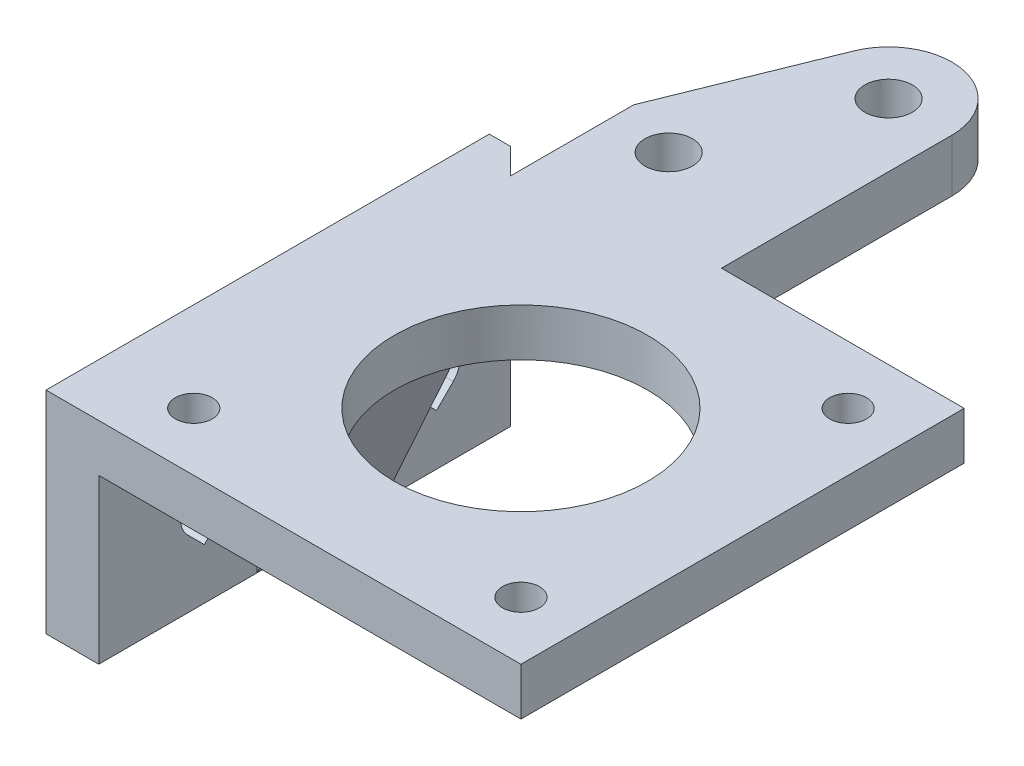
ISO-10303-21;
HEADER;
FILE_DESCRIPTION(('STEP AP214'),'2;1');
FILE_NAME('part.step','',(''),(''),'','','');
FILE_SCHEMA(('AUTOMOTIVE_DESIGN { 1 0 10303 214 1 1 1 1 }'));
ENDSEC;
DATA;
#1=APPLICATION_CONTEXT('core data for automotive mechanical design processes');
#2=APPLICATION_PROTOCOL_DEFINITION('international standard','automotive_design',2000,#1);
#3=PRODUCT_CONTEXT('',#1,'mechanical');
#4=PRODUCT('Part','Part','',(#3));
#5=PRODUCT_RELATED_PRODUCT_CATEGORY('part','',(#4));
#6=PRODUCT_DEFINITION_FORMATION('','',#4);
#7=PRODUCT_DEFINITION_CONTEXT('part definition',#1,'design');
#8=PRODUCT_DEFINITION('design','',#6,#7);
#9=PRODUCT_DEFINITION_SHAPE('','',#8);
#10=(LENGTH_UNIT() NAMED_UNIT(*) SI_UNIT(.MILLI.,.METRE.));
#11=(NAMED_UNIT(*) PLANE_ANGLE_UNIT() SI_UNIT($,.RADIAN.));
#12=(NAMED_UNIT(*) SI_UNIT($,.STERADIAN.) SOLID_ANGLE_UNIT());
#13=UNCERTAINTY_MEASURE_WITH_UNIT(LENGTH_MEASURE(1.E-05),#10,'distance_accuracy_value','');
#14=(GEOMETRIC_REPRESENTATION_CONTEXT(3) GLOBAL_UNCERTAINTY_ASSIGNED_CONTEXT((#13)) GLOBAL_UNIT_ASSIGNED_CONTEXT((#10,
#11,#12)) REPRESENTATION_CONTEXT('',''));
#15=CARTESIAN_POINT('',(0.,0.,0.));
#16=DIRECTION('',(0.,0.,1.));
#17=DIRECTION('',(1.,0.,0.));
#18=AXIS2_PLACEMENT_3D('',#15,#16,#17);
#19=CARTESIAN_POINT('',(45.,-4.5,21.));
#20=DIRECTION('',(0.,1.,0.));
#21=DIRECTION('',(-1.,0.,0.));
#22=AXIS2_PLACEMENT_3D('',#19,#20,#21);
#23=PLANE('',#22);
#24=CARTESIAN_POINT('',(39.5,-4.5,15.5));
#25=DIRECTION('',(0.,1.,0.));
#26=DIRECTION('',(-1.,0.,0.));
#27=AXIS2_PLACEMENT_3D('',#24,#25,#26);
#28=CIRCLE('',#27,1.75);
#29=CARTESIAN_POINT('',(37.75,-4.5,15.5));
#30=VERTEX_POINT('',#29);
#31=EDGE_CURVE('E319',#30,#30,#28,.F.);
#32=ORIENTED_EDGE('',*,*,#31,.F.);
#33=EDGE_LOOP('',(#32));
#34=FACE_BOUND('',#33,.T.);
#35=CARTESIAN_POINT('',(8.5,-4.50000000000001,15.5));
#36=DIRECTION('',(0.,1.,0.));
#37=DIRECTION('',(-1.,0.,0.));
#38=AXIS2_PLACEMENT_3D('',#35,#36,#37);
#39=CIRCLE('',#38,1.75);
#40=CARTESIAN_POINT('',(6.75,-4.50000000000001,15.5));
#41=VERTEX_POINT('',#40);
#42=EDGE_CURVE('E313',#41,#41,#39,.F.);
#43=ORIENTED_EDGE('',*,*,#42,.F.);
#44=EDGE_LOOP('',(#43));
#45=FACE_BOUND('',#44,.T.);
#46=CARTESIAN_POINT('',(39.5,-4.5,-15.5));
#47=DIRECTION('',(0.,1.,0.));
#48=DIRECTION('',(-1.,0.,0.));
#49=AXIS2_PLACEMENT_3D('',#46,#47,#48);
#50=CIRCLE('',#49,1.75);
#51=CARTESIAN_POINT('',(37.75,-4.5,-15.5));
#52=VERTEX_POINT('',#51);
#53=EDGE_CURVE('E307',#52,#52,#50,.F.);
#54=ORIENTED_EDGE('',*,*,#53,.F.);
#55=EDGE_LOOP('',(#54));
#56=FACE_BOUND('',#55,.T.);
#57=DIRECTION('',(-0.984783558817937,0.,0.173785333909048));
#58=VECTOR('',#57,1.);
#59=CARTESIAN_POINT('',(5.,-4.5,-18.));
#60=LINE('',#59,#58);
#61=CARTESIAN_POINT('',(22.,-4.5,-21.));
#62=VERTEX_POINT('',#61);
#63=CARTESIAN_POINT('',(5.,-4.5,-18.));
#64=VERTEX_POINT('',#63);
#65=EDGE_CURVE('E208',#62,#64,#60,.T.);
#66=ORIENTED_EDGE('',*,*,#65,.F.);
#67=DIRECTION('',(1.,0.,0.));
#68=VECTOR('',#67,1.);
#69=CARTESIAN_POINT('',(45.,-4.5,-21.));
#70=LINE('',#69,#68);
#71=CARTESIAN_POINT('',(45.,-4.5,-21.));
#72=VERTEX_POINT('',#71);
#73=EDGE_CURVE('E280',#62,#72,#70,.T.);
#74=ORIENTED_EDGE('',*,*,#73,.T.);
#75=DIRECTION('',(0.,0.,-1.));
#76=VECTOR('',#75,1.);
#77=CARTESIAN_POINT('',(45.,-4.5,21.));
#78=LINE('',#77,#76);
#79=CARTESIAN_POINT('',(45.,-4.5,21.));
#80=VERTEX_POINT('',#79);
#81=EDGE_CURVE('E430',#80,#72,#78,.T.);
#82=ORIENTED_EDGE('',*,*,#81,.F.);
#83=DIRECTION('',(1.,0.,0.));
#84=VECTOR('',#83,1.);
#85=CARTESIAN_POINT('',(45.,-4.5,21.));
#86=LINE('',#85,#84);
#87=CARTESIAN_POINT('',(5.,-4.5,21.));
#88=VERTEX_POINT('',#87);
#89=EDGE_CURVE('E294',#88,#80,#86,.T.);
#90=ORIENTED_EDGE('',*,*,#89,.F.);
#91=DIRECTION('',(0.,0.,-1.));
#92=VECTOR('',#91,1.);
#93=CARTESIAN_POINT('',(5.,-4.5,21.));
#94=LINE('',#93,#92);
#95=CARTESIAN_POINT('',(5.,-4.5,6.));
#96=VERTEX_POINT('',#95);
#97=EDGE_CURVE('E417',#88,#96,#94,.T.);
#98=ORIENTED_EDGE('',*,*,#97,.T.);
#99=DIRECTION('',(-1.,0.,0.));
#100=VECTOR('',#99,1.);
#101=CARTESIAN_POINT('',(12.,-4.50000000000001,6.));
#102=LINE('',#101,#100);
#103=CARTESIAN_POINT('',(12.,-4.50000000000001,6.));
#104=VERTEX_POINT('',#103);
#105=EDGE_CURVE('E342',#104,#96,#102,.T.);
#106=ORIENTED_EDGE('',*,*,#105,.F.);
#107=DIRECTION('',(0.,0.,-1.));
#108=VECTOR('',#107,1.);
#109=CARTESIAN_POINT('',(12.,-4.50000000000001,6.));
#110=LINE('',#109,#108);
#111=CARTESIAN_POINT('',(12.,-4.50000000000001,0.));
#112=VERTEX_POINT('',#111);
#113=EDGE_CURVE('E328',#104,#112,#110,.T.);
#114=ORIENTED_EDGE('',*,*,#113,.T.);
#115=CARTESIAN_POINT('',(24.,-4.5,0.));
#116=DIRECTION('',(0.,1.,0.));
#117=DIRECTION('',(-1.,0.,0.));
#118=AXIS2_PLACEMENT_3D('',#115,#116,#117);
#119=CIRCLE('',#118,12.);
#120=EDGE_CURVE('E289',#112,#112,#119,.F.);
#121=ORIENTED_EDGE('',*,*,#120,.F.);
#122=CARTESIAN_POINT('',(12.,-4.50000000000001,-6.));
#123=VERTEX_POINT('',#122);
#124=EDGE_CURVE('E331',#112,#123,#110,.T.);
#125=ORIENTED_EDGE('',*,*,#124,.T.);
#126=DIRECTION('',(-1.,0.,0.));
#127=VECTOR('',#126,1.);
#128=CARTESIAN_POINT('',(12.,-4.50000000000001,-6.));
#129=LINE('',#128,#127);
#130=CARTESIAN_POINT('',(5.,-4.5,-5.99999999999999));
#131=VERTEX_POINT('',#130);
#132=EDGE_CURVE('E332',#123,#131,#129,.T.);
#133=ORIENTED_EDGE('',*,*,#132,.T.);
#134=EDGE_CURVE('E251',#131,#64,#94,.T.);
#135=ORIENTED_EDGE('',*,*,#134,.T.);
#136=EDGE_LOOP('',(#66,#74,#82,#90,#98,#106,#114,#121,#125,#133,#135));
#137=FACE_BOUND('',#136,.T.);
#138=ADVANCED_FACE('F32',(#34,#45,#56,#137),#23,.F.);
#139=CARTESIAN_POINT('',(5.,-4.5,-18.));
#140=DIRECTION('',(0.707106781186546,0.,-0.707106781186549));
#141=DIRECTION('',(0.,-1.,0.));
#142=AXIS2_PLACEMENT_3D('',#139,#140,#141);
#143=PLANE('',#142);
#144=DIRECTION('',(0.,1.,0.));
#145=VECTOR('',#144,1.);
#146=CARTESIAN_POINT('',(4.43785113467825,-4.5,-18.5621488653217));
#147=LINE('',#146,#145);
#148=CARTESIAN_POINT('',(4.43785113467825,-5.,-18.5621488653217));
#149=VERTEX_POINT('',#148);
#150=CARTESIAN_POINT('',(4.43785113467825,0.,-18.5621488653217));
#151=VERTEX_POINT('',#150);
#152=EDGE_CURVE('E11',#149,#151,#147,.T.);
#153=ORIENTED_EDGE('',*,*,#152,.F.);
#154=DIRECTION('',(-0.707106781186541,0.,-0.707106781186554));
#155=VECTOR('',#154,1.);
#156=CARTESIAN_POINT('',(4.43785113467825,-5.,-18.5621488653217));
#157=LINE('',#156,#155);
#158=CARTESIAN_POINT('',(5.,-5.,-18.));
#159=VERTEX_POINT('',#158);
#160=EDGE_CURVE('E190',#159,#149,#157,.T.);
#161=ORIENTED_EDGE('',*,*,#160,.F.);
#162=DIRECTION('',(0.,1.,0.));
#163=VECTOR('',#162,1.);
#164=CARTESIAN_POINT('',(5.,-4.5,-18.));
#165=LINE('',#164,#163);
#166=CARTESIAN_POINT('',(5.,-20.,-18.));
#167=VERTEX_POINT('',#166);
#168=EDGE_CURVE('E258',#167,#159,#165,.T.);
#169=ORIENTED_EDGE('',*,*,#168,.F.);
#170=DIRECTION('',(0.707106781186549,0.,0.707106781186546));
#171=VECTOR('',#170,1.);
#172=CARTESIAN_POINT('',(5.,-20.,-18.));
#173=LINE('',#172,#171);
#174=CARTESIAN_POINT('',(1.99999999999999,-20.,-21.));
#175=VERTEX_POINT('',#174);
#176=EDGE_CURVE('E41',#175,#167,#173,.T.);
#177=ORIENTED_EDGE('',*,*,#176,.F.);
#178=DIRECTION('',(0.,-1.,0.));
#179=VECTOR('',#178,1.);
#180=CARTESIAN_POINT('',(1.99999999999999,-20.,-21.));
#181=LINE('',#180,#179);
#182=CARTESIAN_POINT('',(1.99999999999998,0.,-21.));
#183=VERTEX_POINT('',#182);
#184=EDGE_CURVE('E49',#183,#175,#181,.T.);
#185=ORIENTED_EDGE('',*,*,#184,.F.);
#186=DIRECTION('',(-0.707106781186549,0.,-0.707106781186546));
#187=VECTOR('',#186,1.);
#188=CARTESIAN_POINT('',(5.,0.,-18.));
#189=LINE('',#188,#187);
#190=EDGE_CURVE('E192',#151,#183,#189,.T.);
#191=ORIENTED_EDGE('',*,*,#190,.F.);
#192=EDGE_LOOP('',(#153,#161,#169,#177,#185,#191));
#193=FACE_BOUND('',#192,.T.);
#194=ADVANCED_FACE('F34',(#193),#143,.T.);
#195=CARTESIAN_POINT('',(0.,0.,-21.));
#196=DIRECTION('',(0.,0.,-1.));
#197=DIRECTION('',(-1.,0.,0.));
#198=AXIS2_PLACEMENT_3D('',#195,#196,#197);
#199=PLANE('',#198);
#200=ORIENTED_EDGE('',*,*,#73,.F.);
#201=DIRECTION('',(0.,1.,0.));
#202=VECTOR('',#201,1.);
#203=CARTESIAN_POINT('',(22.,-37.4100500470099,-21.));
#204=LINE('',#203,#202);
#205=CARTESIAN_POINT('',(22.,0.,-21.));
#206=VERTEX_POINT('',#205);
#207=EDGE_CURVE('E237',#62,#206,#204,.T.);
#208=ORIENTED_EDGE('',*,*,#207,.T.);
#209=DIRECTION('',(-1.,0.,0.));
#210=VECTOR('',#209,1.);
#211=CARTESIAN_POINT('',(0.,0.,-21.));
#212=LINE('',#211,#210);
#213=CARTESIAN_POINT('',(45.,0.,-21.));
#214=VERTEX_POINT('',#213);
#215=EDGE_CURVE('E264',#214,#206,#212,.T.);
#216=ORIENTED_EDGE('',*,*,#215,.F.);
#217=DIRECTION('',(0.,1.,0.));
#218=VECTOR('',#217,1.);
#219=CARTESIAN_POINT('',(45.,0.,-21.));
#220=LINE('',#219,#218);
#221=EDGE_CURVE('E265',#72,#214,#220,.T.);
#222=ORIENTED_EDGE('',*,*,#221,.F.);
#223=EDGE_LOOP('',(#200,#208,#216,#222));
#224=FACE_BOUND('',#223,.T.);
#225=ADVANCED_FACE('F409',(#224),#199,.T.);
#226=CARTESIAN_POINT('',(5.,-4.5,21.));
#227=DIRECTION('',(-1.,0.,0.));
#228=DIRECTION('',(0.,-1.,0.));
#229=AXIS2_PLACEMENT_3D('',#226,#227,#228);
#230=PLANE('',#229);
#231=DIRECTION('',(0.,-0.707106781186548,-0.707106781186547));
#232=VECTOR('',#231,1.);
#233=CARTESIAN_POINT('',(5.,-13.5909902576697,12.5909902576697));
#234=LINE('',#233,#232);
#235=CARTESIAN_POINT('',(5.,-13.5909902576697,12.5909902576697));
#236=VERTEX_POINT('',#235);
#237=CARTESIAN_POINT('',(5.,-15.1819805153395,11.));
#238=VERTEX_POINT('',#237);
#239=EDGE_CURVE('E382',#236,#238,#234,.T.);
#240=ORIENTED_EDGE('',*,*,#239,.F.);
#241=CARTESIAN_POINT('',(5.,-12.,11.));
#242=DIRECTION('',(1.,0.,0.));
#243=DIRECTION('',(0.,1.,0.));
#244=AXIS2_PLACEMENT_3D('',#241,#242,#243);
#245=CIRCLE('',#244,2.25);
#246=CARTESIAN_POINT('',(5.,-13.5909902576697,9.40900974233027));
#247=VERTEX_POINT('',#246);
#248=EDGE_CURVE('E239',#247,#236,#245,.T.);
#249=ORIENTED_EDGE('',*,*,#248,.F.);
#250=DIRECTION('',(0.,0.707106781186547,-0.707106781186548));
#251=VECTOR('',#250,1.);
#252=CARTESIAN_POINT('',(5.,-15.1819805153395,11.));
#253=LINE('',#252,#251);
#254=EDGE_CURVE('E379',#238,#247,#253,.T.);
#255=ORIENTED_EDGE('',*,*,#254,.F.);
#256=EDGE_LOOP('',(#240,#249,#255));
#257=FACE_BOUND('',#256,.T.);
#258=DIRECTION('',(0.,-1.,0.));
#259=VECTOR('',#258,1.);
#260=CARTESIAN_POINT('',(5.,-4.5,6.));
#261=LINE('',#260,#259);
#262=CARTESIAN_POINT('',(5.,-20.,6.));
#263=VERTEX_POINT('',#262);
#264=EDGE_CURVE('E335',#96,#263,#261,.T.);
#265=ORIENTED_EDGE('',*,*,#264,.F.);
#266=ORIENTED_EDGE('',*,*,#97,.F.);
#267=DIRECTION('',(0.,1.,0.));
#268=VECTOR('',#267,1.);
#269=CARTESIAN_POINT('',(5.,-4.5,21.));
#270=LINE('',#269,#268);
#271=CARTESIAN_POINT('',(5.,-20.,21.));
#272=VERTEX_POINT('',#271);
#273=EDGE_CURVE('E296',#272,#88,#270,.T.);
#274=ORIENTED_EDGE('',*,*,#273,.F.);
#275=DIRECTION('',(0.,0.,-1.));
#276=VECTOR('',#275,1.);
#277=CARTESIAN_POINT('',(5.,-20.,21.));
#278=LINE('',#277,#276);
#279=EDGE_CURVE('E420',#272,#263,#278,.T.);
#280=ORIENTED_EDGE('',*,*,#279,.T.);
#281=EDGE_LOOP('',(#265,#266,#274,#280));
#282=FACE_BOUND('',#281,.T.);
#283=ADVANCED_FACE('F406',(#257,#282),#230,.F.);
#284=CARTESIAN_POINT('',(0.,-20.,21.));
#285=DIRECTION('',(1.,0.,0.));
#286=DIRECTION('',(0.,0.,-1.));
#287=AXIS2_PLACEMENT_3D('',#284,#285,#286);
#288=PLANE('',#287);
#289=DIRECTION('',(0.,0.707106781186547,-0.707106781186548));
#290=VECTOR('',#289,1.);
#291=CARTESIAN_POINT('',(0.,-15.1819805153395,11.));
#292=LINE('',#291,#290);
#293=CARTESIAN_POINT('',(0.,-15.1819805153395,11.));
#294=VERTEX_POINT('',#293);
#295=CARTESIAN_POINT('',(0.,-13.5909902576697,9.40900974233027));
#296=VERTEX_POINT('',#295);
#297=EDGE_CURVE('E376',#294,#296,#292,.T.);
#298=ORIENTED_EDGE('',*,*,#297,.T.);
#299=CARTESIAN_POINT('',(0.,-12.,11.));
#300=DIRECTION('',(1.,0.,0.));
#301=DIRECTION('',(0.,1.,0.));
#302=AXIS2_PLACEMENT_3D('',#299,#300,#301);
#303=CIRCLE('',#302,2.25);
#304=CARTESIAN_POINT('',(0.,-13.5909902576697,12.5909902576697));
#305=VERTEX_POINT('',#304);
#306=EDGE_CURVE('E246',#296,#305,#303,.T.);
#307=ORIENTED_EDGE('',*,*,#306,.T.);
#308=DIRECTION('',(0.,-0.707106781186548,-0.707106781186547));
#309=VECTOR('',#308,1.);
#310=CARTESIAN_POINT('',(0.,-13.5909902576697,12.5909902576697));
#311=LINE('',#310,#309);
#312=EDGE_CURVE('E387',#305,#294,#311,.T.);
#313=ORIENTED_EDGE('',*,*,#312,.T.);
#314=EDGE_LOOP('',(#298,#307,#313));
#315=FACE_BOUND('',#314,.T.);
#316=DIRECTION('',(0.,0.707106781186548,-0.707106781186547));
#317=VECTOR('',#316,1.);
#318=CARTESIAN_POINT('',(0.,-15.1819805153395,-11.));
#319=LINE('',#318,#317);
#320=CARTESIAN_POINT('',(0.,-15.1819805153395,-11.));
#321=VERTEX_POINT('',#320);
#322=CARTESIAN_POINT('',(0.,-13.5909902576697,-12.5909902576697));
#323=VERTEX_POINT('',#322);
#324=EDGE_CURVE('E352',#321,#323,#319,.T.);
#325=ORIENTED_EDGE('',*,*,#324,.T.);
#326=CARTESIAN_POINT('',(0.,-12.,-11.));
#327=DIRECTION('',(1.,0.,0.));
#328=DIRECTION('',(0.,1.,0.));
#329=AXIS2_PLACEMENT_3D('',#326,#327,#328);
#330=CIRCLE('',#329,2.25);
#331=CARTESIAN_POINT('',(0.,-13.5909902576697,-9.40900974233027));
#332=VERTEX_POINT('',#331);
#333=EDGE_CURVE('E358',#323,#332,#330,.T.);
#334=ORIENTED_EDGE('',*,*,#333,.T.);
#335=DIRECTION('',(0.,-0.707106781186548,-0.707106781186547));
#336=VECTOR('',#335,1.);
#337=CARTESIAN_POINT('',(0.,-13.5909902576697,-9.40900974233027));
#338=LINE('',#337,#336);
#339=EDGE_CURVE('E367',#332,#321,#338,.T.);
#340=ORIENTED_EDGE('',*,*,#339,.T.);
#341=EDGE_LOOP('',(#325,#334,#340));
#342=FACE_BOUND('',#341,.T.);
#343=DIRECTION('',(0.,-1.,0.));
#344=VECTOR('',#343,1.);
#345=CARTESIAN_POINT('',(0.,-20.,-21.));
#346=LINE('',#345,#344);
#347=CARTESIAN_POINT('',(0.,0.,-21.));
#348=VERTEX_POINT('',#347);
#349=CARTESIAN_POINT('',(0.,-20.,-21.));
#350=VERTEX_POINT('',#349);
#351=EDGE_CURVE('E286',#348,#350,#346,.T.);
#352=ORIENTED_EDGE('',*,*,#351,.T.);
#353=DIRECTION('',(0.,0.,-1.));
#354=VECTOR('',#353,1.);
#355=CARTESIAN_POINT('',(0.,-20.,21.));
#356=LINE('',#355,#354);
#357=CARTESIAN_POINT('',(0.,-20.,21.));
#358=VERTEX_POINT('',#357);
#359=EDGE_CURVE('E260',#358,#350,#356,.T.);
#360=ORIENTED_EDGE('',*,*,#359,.F.);
#361=DIRECTION('',(0.,-1.,0.));
#362=VECTOR('',#361,1.);
#363=CARTESIAN_POINT('',(0.,-20.,21.));
#364=LINE('',#363,#362);
#365=CARTESIAN_POINT('',(0.,0.,21.));
#366=VERTEX_POINT('',#365);
#367=EDGE_CURVE('E278',#366,#358,#364,.T.);
#368=ORIENTED_EDGE('',*,*,#367,.F.);
#369=DIRECTION('',(0.,0.,-1.));
#370=VECTOR('',#369,1.);
#371=CARTESIAN_POINT('',(0.,0.,21.));
#372=LINE('',#371,#370);
#373=EDGE_CURVE('E271',#366,#348,#372,.T.);
#374=ORIENTED_EDGE('',*,*,#373,.T.);
#375=EDGE_LOOP('',(#352,#360,#368,#374));
#376=FACE_BOUND('',#375,.T.);
#377=ADVANCED_FACE('F393',(#315,#342,#376),#288,.F.);
#378=CARTESIAN_POINT('',(5.,-20.,21.));
#379=DIRECTION('',(0.,1.,0.));
#380=DIRECTION('',(0.,0.,1.));
#381=AXIS2_PLACEMENT_3D('',#378,#379,#380);
#382=PLANE('',#381);
#383=DIRECTION('',(1.,0.,0.));
#384=VECTOR('',#383,1.);
#385=CARTESIAN_POINT('',(5.,-20.,-21.));
#386=LINE('',#385,#384);
#387=EDGE_CURVE('E282',#350,#175,#386,.T.);
#388=ORIENTED_EDGE('',*,*,#387,.T.);
#389=ORIENTED_EDGE('',*,*,#176,.T.);
#390=CARTESIAN_POINT('',(5.,-20.,-6.));
#391=VERTEX_POINT('',#390);
#392=EDGE_CURVE('E427',#391,#167,#278,.T.);
#393=ORIENTED_EDGE('',*,*,#392,.F.);
#394=DIRECTION('',(0.,0.,-1.));
#395=VECTOR('',#394,1.);
#396=CARTESIAN_POINT('',(5.,-20.,6.));
#397=LINE('',#396,#395);
#398=EDGE_CURVE('E325',#263,#391,#397,.T.);
#399=ORIENTED_EDGE('',*,*,#398,.F.);
#400=ORIENTED_EDGE('',*,*,#279,.F.);
#401=DIRECTION('',(1.,0.,0.));
#402=VECTOR('',#401,1.);
#403=CARTESIAN_POINT('',(5.,-20.,21.));
#404=LINE('',#403,#402);
#405=EDGE_CURVE('E298',#358,#272,#404,.T.);
#406=ORIENTED_EDGE('',*,*,#405,.F.);
#407=ORIENTED_EDGE('',*,*,#359,.T.);
#408=EDGE_LOOP('',(#388,#389,#393,#399,#400,#406,#407));
#409=FACE_BOUND('',#408,.T.);
#410=ADVANCED_FACE('F436',(#409),#382,.F.);
#411=DIRECTION('',(0.,-0.707106781186548,-0.707106781186547));
#412=VECTOR('',#411,1.);
#413=CARTESIAN_POINT('',(5.,-13.5909902576697,-9.40900974233027));
#414=LINE('',#413,#412);
#415=CARTESIAN_POINT('',(5.,-13.5909902576697,-9.40900974233027));
#416=VERTEX_POINT('',#415);
#417=CARTESIAN_POINT('',(5.,-15.1819805153395,-11.));
#418=VERTEX_POINT('',#417);
#419=EDGE_CURVE('E359',#416,#418,#414,.T.);
#420=ORIENTED_EDGE('',*,*,#419,.F.);
#421=CARTESIAN_POINT('',(5.,-12.,-11.));
#422=DIRECTION('',(1.,0.,0.));
#423=DIRECTION('',(0.,1.,0.));
#424=AXIS2_PLACEMENT_3D('',#421,#422,#423);
#425=CIRCLE('',#424,2.25);
#426=CARTESIAN_POINT('',(5.,-13.5909902576697,-12.5909902576697));
#427=VERTEX_POINT('',#426);
#428=EDGE_CURVE('E362',#427,#416,#425,.T.);
#429=ORIENTED_EDGE('',*,*,#428,.F.);
#430=DIRECTION('',(0.,0.707106781186548,-0.707106781186547));
#431=VECTOR('',#430,1.);
#432=CARTESIAN_POINT('',(5.,-15.1819805153395,-11.));
#433=LINE('',#432,#431);
#434=EDGE_CURVE('E355',#418,#427,#433,.T.);
#435=ORIENTED_EDGE('',*,*,#434,.F.);
#436=EDGE_LOOP('',(#420,#429,#435));
#437=FACE_BOUND('',#436,.T.);
#438=ORIENTED_EDGE('',*,*,#392,.T.);
#439=ORIENTED_EDGE('',*,*,#168,.T.);
#440=DIRECTION('',(0.,1.,0.));
#441=VECTOR('',#440,1.);
#442=CARTESIAN_POINT('',(5.,-5.,-18.));
#443=LINE('',#442,#441);
#444=EDGE_CURVE('E221',#159,#64,#443,.T.);
#445=ORIENTED_EDGE('',*,*,#444,.T.);
#446=ORIENTED_EDGE('',*,*,#134,.F.);
#447=DIRECTION('',(0.,-1.,0.));
#448=VECTOR('',#447,1.);
#449=CARTESIAN_POINT('',(5.,-4.5,-6.));
#450=LINE('',#449,#448);
#451=EDGE_CURVE('E338',#131,#391,#450,.T.);
#452=ORIENTED_EDGE('',*,*,#451,.T.);
#453=EDGE_LOOP('',(#438,#439,#445,#446,#452));
#454=FACE_BOUND('',#453,.T.);
#455=ADVANCED_FACE('F411',(#437,#454),#230,.F.);
#456=CARTESIAN_POINT('',(45.,0.,21.));
#457=DIRECTION('',(-1.,0.,0.));
#458=DIRECTION('',(0.,0.,1.));
#459=AXIS2_PLACEMENT_3D('',#456,#457,#458);
#460=PLANE('',#459);
#461=ORIENTED_EDGE('',*,*,#221,.T.);
#462=DIRECTION('',(0.,0.,-1.));
#463=VECTOR('',#462,1.);
#464=CARTESIAN_POINT('',(45.,0.,21.));
#465=LINE('',#464,#463);
#466=CARTESIAN_POINT('',(45.,0.,21.));
#467=VERTEX_POINT('',#466);
#468=EDGE_CURVE('E469',#467,#214,#465,.T.);
#469=ORIENTED_EDGE('',*,*,#468,.F.);
#470=DIRECTION('',(0.,1.,0.));
#471=VECTOR('',#470,1.);
#472=CARTESIAN_POINT('',(45.,0.,21.));
#473=LINE('',#472,#471);
#474=EDGE_CURVE('E292',#80,#467,#473,.T.);
#475=ORIENTED_EDGE('',*,*,#474,.F.);
#476=ORIENTED_EDGE('',*,*,#81,.T.);
#477=EDGE_LOOP('',(#461,#469,#475,#476));
#478=FACE_BOUND('',#477,.T.);
#479=ADVANCED_FACE('F472',(#478),#460,.F.);
#480=CARTESIAN_POINT('',(0.,0.,21.));
#481=DIRECTION('',(0.,-1.,0.));
#482=DIRECTION('',(0.,0.,-1.));
#483=AXIS2_PLACEMENT_3D('',#480,#481,#482);
#484=PLANE('',#483);
#485=CARTESIAN_POINT('',(39.5,0.,15.5));
#486=DIRECTION('',(0.,1.,0.));
#487=DIRECTION('',(0.,0.,1.));
#488=AXIS2_PLACEMENT_3D('',#485,#486,#487);
#489=CIRCLE('',#488,1.75);
#490=CARTESIAN_POINT('',(39.5,0.,17.25));
#491=VERTEX_POINT('',#490);
#492=EDGE_CURVE('E322',#491,#491,#489,.T.);
#493=ORIENTED_EDGE('',*,*,#492,.F.);
#494=EDGE_LOOP('',(#493));
#495=FACE_BOUND('',#494,.T.);
#496=CARTESIAN_POINT('',(8.5,0.,15.5));
#497=DIRECTION('',(0.,1.,0.));
#498=DIRECTION('',(0.,0.,1.));
#499=AXIS2_PLACEMENT_3D('',#496,#497,#498);
#500=CIRCLE('',#499,1.75);
#501=CARTESIAN_POINT('',(8.5,0.,17.25));
#502=VERTEX_POINT('',#501);
#503=EDGE_CURVE('E316',#502,#502,#500,.T.);
#504=ORIENTED_EDGE('',*,*,#503,.F.);
#505=EDGE_LOOP('',(#504));
#506=FACE_BOUND('',#505,.T.);
#507=CARTESIAN_POINT('',(39.5,0.,-15.5));
#508=DIRECTION('',(0.,1.,0.));
#509=DIRECTION('',(0.,0.,1.));
#510=AXIS2_PLACEMENT_3D('',#507,#508,#509);
#511=CIRCLE('',#510,1.75);
#512=CARTESIAN_POINT('',(39.5,0.,-13.75));
#513=VERTEX_POINT('',#512);
#514=EDGE_CURVE('E310',#513,#513,#511,.T.);
#515=ORIENTED_EDGE('',*,*,#514,.F.);
#516=EDGE_LOOP('',(#515));
#517=FACE_BOUND('',#516,.T.);
#518=CARTESIAN_POINT('',(24.,0.,0.));
#519=DIRECTION('',(0.,1.,0.));
#520=DIRECTION('',(0.,0.,1.));
#521=AXIS2_PLACEMENT_3D('',#518,#519,#520);
#522=CIRCLE('',#521,12.);
#523=CARTESIAN_POINT('',(24.,0.,12.));
#524=VERTEX_POINT('',#523);
#525=EDGE_CURVE('E304',#524,#524,#522,.T.);
#526=ORIENTED_EDGE('',*,*,#525,.F.);
#527=EDGE_LOOP('',(#526));
#528=FACE_BOUND('',#527,.T.);
#529=DIRECTION('',(0.,0.,1.));
#530=VECTOR('',#529,1.);
#531=CARTESIAN_POINT('',(4.43785113467825,0.,-21.));
#532=LINE('',#531,#530);
#533=CARTESIAN_POINT('',(4.43785113467825,0.,-30.25));
#534=VERTEX_POINT('',#533);
#535=EDGE_CURVE('E57',#534,#151,#532,.T.);
#536=ORIENTED_EDGE('',*,*,#535,.T.);
#537=ORIENTED_EDGE('',*,*,#190,.T.);
#538=EDGE_CURVE('E261',#183,#348,#212,.T.);
#539=ORIENTED_EDGE('',*,*,#538,.T.);
#540=ORIENTED_EDGE('',*,*,#373,.F.);
#541=DIRECTION('',(-1.,0.,0.));
#542=VECTOR('',#541,1.);
#543=CARTESIAN_POINT('',(0.,0.,21.));
#544=LINE('',#543,#542);
#545=EDGE_CURVE('E290',#467,#366,#544,.T.);
#546=ORIENTED_EDGE('',*,*,#545,.F.);
#547=ORIENTED_EDGE('',*,*,#468,.T.);
#548=ORIENTED_EDGE('',*,*,#215,.T.);
#549=DIRECTION('',(0.,0.,-1.));
#550=VECTOR('',#549,1.);
#551=CARTESIAN_POINT('',(22.,0.,-42.8323969741913));
#552=LINE('',#551,#550);
#553=CARTESIAN_POINT('',(22.,0.,-42.8323969741913));
#554=VERTEX_POINT('',#553);
#555=EDGE_CURVE('E235',#206,#554,#552,.T.);
#556=ORIENTED_EDGE('',*,*,#555,.T.);
#557=CARTESIAN_POINT('',(16.,0.,-42.8323969741913));
#558=DIRECTION('',(0.,1.,0.));
#559=DIRECTION('',(0.,0.,-1.));
#560=AXIS2_PLACEMENT_3D('',#557,#558,#559);
#561=CIRCLE('',#560,6.);
#562=CARTESIAN_POINT('',(10.4378511346783,0.,-45.0823969741913));
#563=VERTEX_POINT('',#562);
#564=EDGE_CURVE('E231',#554,#563,#561,.T.);
#565=ORIENTED_EDGE('',*,*,#564,.T.);
#566=DIRECTION('',(-0.375,0.,0.927024810886958));
#567=VECTOR('',#566,1.);
#568=CARTESIAN_POINT('',(4.43785113467825,0.,-30.25));
#569=LINE('',#568,#567);
#570=EDGE_CURVE('E234',#563,#534,#569,.T.);
#571=ORIENTED_EDGE('',*,*,#570,.T.);
#572=EDGE_LOOP('',(#536,#537,#539,#540,#546,#547,#548,#556,#565,#571));
#573=FACE_BOUND('',#572,.T.);
#574=CARTESIAN_POINT('',(16.,0.,-42.8323969741913));
#575=DIRECTION('',(0.,1.,0.));
#576=DIRECTION('',(0.,0.,1.));
#577=AXIS2_PLACEMENT_3D('',#574,#575,#576);
#578=CIRCLE('',#577,2.25);
#579=CARTESIAN_POINT('',(16.,0.,-40.5823969741913));
#580=VERTEX_POINT('',#579);
#581=EDGE_CURVE('E225',#580,#580,#578,.T.);
#582=ORIENTED_EDGE('',*,*,#581,.F.);
#583=EDGE_LOOP('',(#582));
#584=FACE_BOUND('',#583,.T.);
#585=CARTESIAN_POINT('',(10.,0.,-28.));
#586=DIRECTION('',(0.,1.,0.));
#587=DIRECTION('',(0.,0.,1.));
#588=AXIS2_PLACEMENT_3D('',#585,#586,#587);
#589=CIRCLE('',#588,2.25);
#590=CARTESIAN_POINT('',(10.,0.,-25.75));
#591=VERTEX_POINT('',#590);
#592=EDGE_CURVE('E228',#591,#591,#589,.T.);
#593=ORIENTED_EDGE('',*,*,#592,.F.);
#594=EDGE_LOOP('',(#593));
#595=FACE_BOUND('',#594,.T.);
#596=ADVANCED_FACE('F463',(#495,#506,#517,#528,#573,#584,#595),#484,.F.);
#597=CARTESIAN_POINT('',(0.,0.,21.));
#598=DIRECTION('',(0.,0.,-1.));
#599=DIRECTION('',(-1.,0.,0.));
#600=AXIS2_PLACEMENT_3D('',#597,#598,#599);
#601=PLANE('',#600);
#602=ORIENTED_EDGE('',*,*,#367,.T.);
#603=ORIENTED_EDGE('',*,*,#405,.T.);
#604=ORIENTED_EDGE('',*,*,#273,.T.);
#605=ORIENTED_EDGE('',*,*,#89,.T.);
#606=ORIENTED_EDGE('',*,*,#474,.T.);
#607=ORIENTED_EDGE('',*,*,#545,.T.);
#608=EDGE_LOOP('',(#602,#603,#604,#605,#606,#607));
#609=FACE_BOUND('',#608,.T.);
#610=ADVANCED_FACE('F474',(#609),#601,.F.);
#611=ORIENTED_EDGE('',*,*,#538,.F.);
#612=ORIENTED_EDGE('',*,*,#184,.T.);
#613=ORIENTED_EDGE('',*,*,#387,.F.);
#614=ORIENTED_EDGE('',*,*,#351,.F.);
#615=EDGE_LOOP('',(#611,#612,#613,#614));
#616=FACE_BOUND('',#615,.T.);
#617=ADVANCED_FACE('F443',(#616),#199,.T.);
#618=CARTESIAN_POINT('',(24.,-20.001,0.));
#619=DIRECTION('',(0.,1.,0.));
#620=DIRECTION('',(0.,0.,1.));
#621=AXIS2_PLACEMENT_3D('',#618,#619,#620);
#622=CYLINDRICAL_SURFACE('',#621,12.);
#623=ORIENTED_EDGE('',*,*,#525,.T.);
#624=EDGE_LOOP('',(#623));
#625=FACE_BOUND('',#624,.T.);
#626=ORIENTED_EDGE('',*,*,#120,.T.);
#627=EDGE_LOOP('',(#626));
#628=FACE_BOUND('',#627,.T.);
#629=ADVANCED_FACE('F486',(#625,#628),#622,.F.);
#630=CARTESIAN_POINT('',(39.5,-20.001,-15.5));
#631=DIRECTION('',(0.,1.,0.));
#632=DIRECTION('',(0.,0.,1.));
#633=AXIS2_PLACEMENT_3D('',#630,#631,#632);
#634=CYLINDRICAL_SURFACE('',#633,1.75);
#635=ORIENTED_EDGE('',*,*,#514,.T.);
#636=EDGE_LOOP('',(#635));
#637=FACE_BOUND('',#636,.T.);
#638=ORIENTED_EDGE('',*,*,#53,.T.);
#639=EDGE_LOOP('',(#638));
#640=FACE_BOUND('',#639,.T.);
#641=ADVANCED_FACE('F488',(#637,#640),#634,.F.);
#642=CARTESIAN_POINT('',(8.5,-20.001,15.5));
#643=DIRECTION('',(0.,1.,0.));
#644=DIRECTION('',(0.,0.,1.));
#645=AXIS2_PLACEMENT_3D('',#642,#643,#644);
#646=CYLINDRICAL_SURFACE('',#645,1.75);
#647=ORIENTED_EDGE('',*,*,#503,.T.);
#648=EDGE_LOOP('',(#647));
#649=FACE_BOUND('',#648,.T.);
#650=ORIENTED_EDGE('',*,*,#42,.T.);
#651=EDGE_LOOP('',(#650));
#652=FACE_BOUND('',#651,.T.);
#653=ADVANCED_FACE('F495',(#649,#652),#646,.F.);
#654=CARTESIAN_POINT('',(39.5,-20.001,15.5));
#655=DIRECTION('',(0.,1.,0.));
#656=DIRECTION('',(0.,0.,1.));
#657=AXIS2_PLACEMENT_3D('',#654,#655,#656);
#658=CYLINDRICAL_SURFACE('',#657,1.75);
#659=ORIENTED_EDGE('',*,*,#492,.T.);
#660=EDGE_LOOP('',(#659));
#661=FACE_BOUND('',#660,.T.);
#662=ORIENTED_EDGE('',*,*,#31,.T.);
#663=EDGE_LOOP('',(#662));
#664=FACE_BOUND('',#663,.T.);
#665=ADVANCED_FACE('F728',(#661,#664),#658,.F.);
#666=CARTESIAN_POINT('',(5.,-20.,6.));
#667=DIRECTION('',(-0.911370599658675,0.411586722426498,0.));
#668=DIRECTION('',(-0.411586722426498,-0.911370599658675,0.));
#669=AXIS2_PLACEMENT_3D('',#666,#667,#668);
#670=PLANE('',#669);
#671=DIRECTION('',(0.411586722426498,0.911370599658675,0.));
#672=VECTOR('',#671,1.);
#673=CARTESIAN_POINT('',(5.,-20.,-6.));
#674=LINE('',#673,#672);
#675=EDGE_CURVE('E336',#391,#123,#674,.T.);
#676=ORIENTED_EDGE('',*,*,#675,.T.);
#677=ORIENTED_EDGE('',*,*,#124,.F.);
#678=ORIENTED_EDGE('',*,*,#113,.F.);
#679=DIRECTION('',(0.411586722426498,0.911370599658675,0.));
#680=VECTOR('',#679,1.);
#681=CARTESIAN_POINT('',(5.,-20.,6.));
#682=LINE('',#681,#680);
#683=EDGE_CURVE('E344',#263,#104,#682,.T.);
#684=ORIENTED_EDGE('',*,*,#683,.F.);
#685=ORIENTED_EDGE('',*,*,#398,.T.);
#686=EDGE_LOOP('',(#676,#677,#678,#684,#685));
#687=FACE_BOUND('',#686,.T.);
#688=ADVANCED_FACE('F477',(#687),#670,.F.);
#689=CARTESIAN_POINT('',(0.,0.,6.));
#690=DIRECTION('',(0.,0.,-1.));
#691=DIRECTION('',(-1.,0.,0.));
#692=AXIS2_PLACEMENT_3D('',#689,#690,#691);
#693=PLANE('',#692);
#694=ORIENTED_EDGE('',*,*,#264,.T.);
#695=ORIENTED_EDGE('',*,*,#683,.T.);
#696=ORIENTED_EDGE('',*,*,#105,.T.);
#697=EDGE_LOOP('',(#694,#695,#696));
#698=FACE_BOUND('',#697,.T.);
#699=ADVANCED_FACE('F715',(#698),#693,.F.);
#700=CARTESIAN_POINT('',(0.,0.,-6.));
#701=DIRECTION('',(0.,0.,-1.));
#702=DIRECTION('',(-1.,0.,0.));
#703=AXIS2_PLACEMENT_3D('',#700,#701,#702);
#704=PLANE('',#703);
#705=ORIENTED_EDGE('',*,*,#451,.F.);
#706=ORIENTED_EDGE('',*,*,#132,.F.);
#707=ORIENTED_EDGE('',*,*,#675,.F.);
#708=EDGE_LOOP('',(#705,#706,#707));
#709=FACE_BOUND('',#708,.T.);
#710=ADVANCED_FACE('F482',(#709),#704,.T.);
#711=CARTESIAN_POINT('',(0.,-12.,-11.));
#712=DIRECTION('',(1.,0.,0.));
#713=DIRECTION('',(0.,1.,0.));
#714=AXIS2_PLACEMENT_3D('',#711,#712,#713);
#715=CYLINDRICAL_SURFACE('',#714,2.25);
#716=ORIENTED_EDGE('',*,*,#428,.T.);
#717=DIRECTION('',(1.,0.,0.));
#718=VECTOR('',#717,1.);
#719=CARTESIAN_POINT('',(0.,-13.5909902576697,-9.40900974233027));
#720=LINE('',#719,#718);
#721=EDGE_CURVE('E348',#332,#416,#720,.T.);
#722=ORIENTED_EDGE('',*,*,#721,.F.);
#723=ORIENTED_EDGE('',*,*,#333,.F.);
#724=DIRECTION('',(1.,0.,0.));
#725=VECTOR('',#724,1.);
#726=CARTESIAN_POINT('',(0.,-13.5909902576697,-12.5909902576697));
#727=LINE('',#726,#725);
#728=EDGE_CURVE('E341',#323,#427,#727,.T.);
#729=ORIENTED_EDGE('',*,*,#728,.T.);
#730=EDGE_LOOP('',(#716,#722,#723,#729));
#731=FACE_BOUND('',#730,.T.);
#732=ADVANCED_FACE('F701',(#731),#715,.F.);
#733=CARTESIAN_POINT('',(0.,-15.1819805153395,-11.));
#734=DIRECTION('',(0.,-0.707106781186547,-0.707106781186548));
#735=DIRECTION('',(0.,0.707106781186548,-0.707106781186547));
#736=AXIS2_PLACEMENT_3D('',#733,#734,#735);
#737=PLANE('',#736);
#738=ORIENTED_EDGE('',*,*,#434,.T.);
#739=ORIENTED_EDGE('',*,*,#728,.F.);
#740=ORIENTED_EDGE('',*,*,#324,.F.);
#741=DIRECTION('',(1.,0.,0.));
#742=VECTOR('',#741,1.);
#743=CARTESIAN_POINT('',(0.,-15.1819805153395,-11.));
#744=LINE('',#743,#742);
#745=EDGE_CURVE('E351',#321,#418,#744,.T.);
#746=ORIENTED_EDGE('',*,*,#745,.T.);
#747=EDGE_LOOP('',(#738,#739,#740,#746));
#748=FACE_BOUND('',#747,.T.);
#749=ADVANCED_FACE('F693',(#748),#737,.F.);
#750=CARTESIAN_POINT('',(0.,-13.5909902576697,-9.40900974233027));
#751=DIRECTION('',(0.,-0.707106781186547,0.707106781186548));
#752=DIRECTION('',(0.,-0.707106781186548,-0.707106781186547));
#753=AXIS2_PLACEMENT_3D('',#750,#751,#752);
#754=PLANE('',#753);
#755=ORIENTED_EDGE('',*,*,#419,.T.);
#756=ORIENTED_EDGE('',*,*,#745,.F.);
#757=ORIENTED_EDGE('',*,*,#339,.F.);
#758=ORIENTED_EDGE('',*,*,#721,.T.);
#759=EDGE_LOOP('',(#755,#756,#757,#758));
#760=FACE_BOUND('',#759,.T.);
#761=ADVANCED_FACE('F686',(#760),#754,.F.);
#762=CARTESIAN_POINT('',(0.,-12.,11.));
#763=DIRECTION('',(1.,0.,0.));
#764=DIRECTION('',(0.,1.,0.));
#765=AXIS2_PLACEMENT_3D('',#762,#763,#764);
#766=CYLINDRICAL_SURFACE('',#765,2.25);
#767=ORIENTED_EDGE('',*,*,#248,.T.);
#768=DIRECTION('',(1.,0.,0.));
#769=VECTOR('',#768,1.);
#770=CARTESIAN_POINT('',(0.,-13.5909902576697,12.5909902576697));
#771=LINE('',#770,#769);
#772=EDGE_CURVE('E372',#305,#236,#771,.T.);
#773=ORIENTED_EDGE('',*,*,#772,.F.);
#774=ORIENTED_EDGE('',*,*,#306,.F.);
#775=DIRECTION('',(1.,0.,0.));
#776=VECTOR('',#775,1.);
#777=CARTESIAN_POINT('',(0.,-13.5909902576697,9.40900974233027));
#778=LINE('',#777,#776);
#779=EDGE_CURVE('E364',#296,#247,#778,.T.);
#780=ORIENTED_EDGE('',*,*,#779,.T.);
#781=EDGE_LOOP('',(#767,#773,#774,#780));
#782=FACE_BOUND('',#781,.T.);
#783=ADVANCED_FACE('F396',(#782),#766,.F.);
#784=CARTESIAN_POINT('',(0.,-15.1819805153395,11.));
#785=DIRECTION('',(0.,-0.707106781186548,-0.707106781186547));
#786=DIRECTION('',(0.,0.707106781186547,-0.707106781186548));
#787=AXIS2_PLACEMENT_3D('',#784,#785,#786);
#788=PLANE('',#787);
#789=ORIENTED_EDGE('',*,*,#254,.T.);
#790=ORIENTED_EDGE('',*,*,#779,.F.);
#791=ORIENTED_EDGE('',*,*,#297,.F.);
#792=DIRECTION('',(1.,0.,0.));
#793=VECTOR('',#792,1.);
#794=CARTESIAN_POINT('',(0.,-15.1819805153395,11.));
#795=LINE('',#794,#793);
#796=EDGE_CURVE('E375',#294,#238,#795,.T.);
#797=ORIENTED_EDGE('',*,*,#796,.T.);
#798=EDGE_LOOP('',(#789,#790,#791,#797));
#799=FACE_BOUND('',#798,.T.);
#800=ADVANCED_FACE('F404',(#799),#788,.F.);
#801=CARTESIAN_POINT('',(0.,-13.5909902576697,12.5909902576697));
#802=DIRECTION('',(0.,-0.707106781186547,0.707106781186548));
#803=DIRECTION('',(0.,-0.707106781186548,-0.707106781186547));
#804=AXIS2_PLACEMENT_3D('',#801,#802,#803);
#805=PLANE('',#804);
#806=ORIENTED_EDGE('',*,*,#239,.T.);
#807=ORIENTED_EDGE('',*,*,#796,.F.);
#808=ORIENTED_EDGE('',*,*,#312,.F.);
#809=ORIENTED_EDGE('',*,*,#772,.T.);
#810=EDGE_LOOP('',(#806,#807,#808,#809));
#811=FACE_BOUND('',#810,.T.);
#812=ADVANCED_FACE('F401',(#811),#805,.F.);
#813=CARTESIAN_POINT('',(22.,-37.4100500470099,-42.8323969741913));
#814=DIRECTION('',(1.,0.,0.));
#815=DIRECTION('',(0.,0.,-1.));
#816=AXIS2_PLACEMENT_3D('',#813,#814,#815);
#817=PLANE('',#816);
#818=ORIENTED_EDGE('',*,*,#207,.F.);
#819=DIRECTION('',(0.,1.,0.));
#820=VECTOR('',#819,1.);
#821=CARTESIAN_POINT('',(22.,-5.,-21.));
#822=LINE('',#821,#820);
#823=CARTESIAN_POINT('',(22.,-5.,-21.));
#824=VERTEX_POINT('',#823);
#825=EDGE_CURVE('E224',#824,#62,#822,.T.);
#826=ORIENTED_EDGE('',*,*,#825,.F.);
#827=DIRECTION('',(0.,0.,1.));
#828=VECTOR('',#827,1.);
#829=CARTESIAN_POINT('',(22.,-5.,-21.));
#830=LINE('',#829,#828);
#831=CARTESIAN_POINT('',(22.,-5.,-42.8323969741913));
#832=VERTEX_POINT('',#831);
#833=EDGE_CURVE('E218',#832,#824,#830,.T.);
#834=ORIENTED_EDGE('',*,*,#833,.F.);
#835=DIRECTION('',(0.,1.,0.));
#836=VECTOR('',#835,1.);
#837=CARTESIAN_POINT('',(22.,-37.4100500470099,-42.8323969741913));
#838=LINE('',#837,#836);
#839=EDGE_CURVE('E242',#832,#554,#838,.T.);
#840=ORIENTED_EDGE('',*,*,#839,.T.);
#841=ORIENTED_EDGE('',*,*,#555,.F.);
#842=EDGE_LOOP('',(#818,#826,#834,#840,#841));
#843=FACE_BOUND('',#842,.T.);
#844=ADVANCED_FACE('F461',(#843),#817,.T.);
#845=CARTESIAN_POINT('',(16.,-37.4100500470099,-42.8323969741913));
#846=DIRECTION('',(0.,1.,0.));
#847=DIRECTION('',(0.,0.,1.));
#848=AXIS2_PLACEMENT_3D('',#845,#846,#847);
#849=CYLINDRICAL_SURFACE('',#848,6.);
#850=ORIENTED_EDGE('',*,*,#839,.F.);
#851=CARTESIAN_POINT('',(16.,-5.,-42.8323969741913));
#852=DIRECTION('',(0.,-1.,0.));
#853=DIRECTION('',(-1.,0.,0.));
#854=AXIS2_PLACEMENT_3D('',#851,#852,#853);
#855=CIRCLE('',#854,6.);
#856=CARTESIAN_POINT('',(10.4378511346783,-5.,-45.0823969741913));
#857=VERTEX_POINT('',#856);
#858=EDGE_CURVE('E215',#857,#832,#855,.T.);
#859=ORIENTED_EDGE('',*,*,#858,.F.);
#860=DIRECTION('',(0.,1.,0.));
#861=VECTOR('',#860,1.);
#862=CARTESIAN_POINT('',(10.4378511346783,-37.4100500470099,-45.0823969741913));
#863=LINE('',#862,#861);
#864=EDGE_CURVE('E240',#857,#563,#863,.T.);
#865=ORIENTED_EDGE('',*,*,#864,.T.);
#866=ORIENTED_EDGE('',*,*,#564,.F.);
#867=EDGE_LOOP('',(#850,#859,#865,#866));
#868=FACE_BOUND('',#867,.T.);
#869=ADVANCED_FACE('F590',(#868),#849,.T.);
#870=CARTESIAN_POINT('',(4.43785113467825,-37.4100500470099,-30.25));
#871=DIRECTION('',(-0.927024810886958,0.,-0.375));
#872=DIRECTION('',(-0.375,0.,0.927024810886958));
#873=AXIS2_PLACEMENT_3D('',#870,#871,#872);
#874=PLANE('',#873);
#875=ORIENTED_EDGE('',*,*,#864,.F.);
#876=DIRECTION('',(0.375,0.,-0.927024810886958));
#877=VECTOR('',#876,1.);
#878=CARTESIAN_POINT('',(10.4378511346783,-5.,-45.0823969741913));
#879=LINE('',#878,#877);
#880=CARTESIAN_POINT('',(4.43785113467825,-5.,-30.25));
#881=VERTEX_POINT('',#880);
#882=EDGE_CURVE('E201',#881,#857,#879,.T.);
#883=ORIENTED_EDGE('',*,*,#882,.F.);
#884=DIRECTION('',(0.,1.,0.));
#885=VECTOR('',#884,1.);
#886=CARTESIAN_POINT('',(4.43785113467825,-37.4100500470099,-30.25));
#887=LINE('',#886,#885);
#888=EDGE_CURVE('E197',#881,#534,#887,.T.);
#889=ORIENTED_EDGE('',*,*,#888,.T.);
#890=ORIENTED_EDGE('',*,*,#570,.F.);
#891=EDGE_LOOP('',(#875,#883,#889,#890));
#892=FACE_BOUND('',#891,.T.);
#893=ADVANCED_FACE('F599',(#892),#874,.T.);
#894=CARTESIAN_POINT('',(4.43785113467825,-37.4100500470099,-21.));
#895=DIRECTION('',(-1.,0.,0.));
#896=DIRECTION('',(0.,0.,1.));
#897=AXIS2_PLACEMENT_3D('',#894,#895,#896);
#898=PLANE('',#897);
#899=ORIENTED_EDGE('',*,*,#888,.F.);
#900=DIRECTION('',(0.,0.,-1.));
#901=VECTOR('',#900,1.);
#902=CARTESIAN_POINT('',(4.43785113467825,-5.,-18.5621488653217));
#903=LINE('',#902,#901);
#904=EDGE_CURVE('E195',#149,#881,#903,.T.);
#905=ORIENTED_EDGE('',*,*,#904,.F.);
#906=ORIENTED_EDGE('',*,*,#152,.T.);
#907=ORIENTED_EDGE('',*,*,#535,.F.);
#908=EDGE_LOOP('',(#899,#905,#906,#907));
#909=FACE_BOUND('',#908,.T.);
#910=ADVANCED_FACE('F196',(#909),#898,.T.);
#911=CARTESIAN_POINT('',(10.,-37.4100500470099,-28.));
#912=DIRECTION('',(0.,1.,0.));
#913=DIRECTION('',(0.,0.,1.));
#914=AXIS2_PLACEMENT_3D('',#911,#912,#913);
#915=CYLINDRICAL_SURFACE('',#914,2.25);
#916=ORIENTED_EDGE('',*,*,#592,.T.);
#917=EDGE_LOOP('',(#916));
#918=FACE_BOUND('',#917,.T.);
#919=CARTESIAN_POINT('',(9.99999999999996,-5.,-28.));
#920=DIRECTION('',(0.,-1.,0.));
#921=DIRECTION('',(1.,0.,0.));
#922=AXIS2_PLACEMENT_3D('',#919,#920,#921);
#923=CIRCLE('',#922,2.25);
#924=CARTESIAN_POINT('',(12.25,-5.,-28.));
#925=VERTEX_POINT('',#924);
#926=EDGE_CURVE('E210',#925,#925,#923,.T.);
#927=ORIENTED_EDGE('',*,*,#926,.T.);
#928=EDGE_LOOP('',(#927));
#929=FACE_BOUND('',#928,.T.);
#930=ADVANCED_FACE('F620',(#918,#929),#915,.F.);
#931=CARTESIAN_POINT('',(16.,-37.4100500470099,-42.8323969741913));
#932=DIRECTION('',(0.,1.,0.));
#933=DIRECTION('',(0.,0.,1.));
#934=AXIS2_PLACEMENT_3D('',#931,#932,#933);
#935=CYLINDRICAL_SURFACE('',#934,2.25);
#936=ORIENTED_EDGE('',*,*,#581,.T.);
#937=EDGE_LOOP('',(#936));
#938=FACE_BOUND('',#937,.T.);
#939=CARTESIAN_POINT('',(16.,-5.,-42.8323969741913));
#940=DIRECTION('',(0.,-1.,0.));
#941=DIRECTION('',(1.,0.,0.));
#942=AXIS2_PLACEMENT_3D('',#939,#940,#941);
#943=CIRCLE('',#942,2.25);
#944=CARTESIAN_POINT('',(18.25,-5.,-42.8323969741913));
#945=VERTEX_POINT('',#944);
#946=EDGE_CURVE('E799',#945,#945,#943,.T.);
#947=ORIENTED_EDGE('',*,*,#946,.T.);
#948=EDGE_LOOP('',(#947));
#949=FACE_BOUND('',#948,.T.);
#950=ADVANCED_FACE('F629',(#938,#949),#935,.F.);
#951=CARTESIAN_POINT('',(16.,-5.,-42.8323969741913));
#952=DIRECTION('',(0.,1.,0.));
#953=DIRECTION('',(-1.,0.,0.));
#954=AXIS2_PLACEMENT_3D('',#951,#952,#953);
#955=PLANE('',#954);
#956=ORIENTED_EDGE('',*,*,#926,.F.);
#957=EDGE_LOOP('',(#956));
#958=FACE_BOUND('',#957,.T.);
#959=ORIENTED_EDGE('',*,*,#160,.T.);
#960=ORIENTED_EDGE('',*,*,#904,.T.);
#961=ORIENTED_EDGE('',*,*,#882,.T.);
#962=ORIENTED_EDGE('',*,*,#858,.T.);
#963=ORIENTED_EDGE('',*,*,#833,.T.);
#964=DIRECTION('',(-0.984783558817937,0.,0.173785333909048));
#965=VECTOR('',#964,1.);
#966=CARTESIAN_POINT('',(5.,-5.,-18.));
#967=LINE('',#966,#965);
#968=EDGE_CURVE('E206',#824,#159,#967,.T.);
#969=ORIENTED_EDGE('',*,*,#968,.T.);
#970=EDGE_LOOP('',(#959,#960,#961,#962,#963,#969));
#971=FACE_BOUND('',#970,.T.);
#972=ORIENTED_EDGE('',*,*,#946,.F.);
#973=EDGE_LOOP('',(#972));
#974=FACE_BOUND('',#973,.T.);
#975=ADVANCED_FACE('F203',(#958,#971,#974),#955,.F.);
#976=CARTESIAN_POINT('',(5.,-5.,-18.));
#977=DIRECTION('',(-0.173785333909049,0.,-0.984783558817937));
#978=DIRECTION('',(-0.984783558817937,0.,0.173785333909049));
#979=AXIS2_PLACEMENT_3D('',#976,#977,#978);
#980=PLANE('',#979);
#981=ORIENTED_EDGE('',*,*,#65,.T.);
#982=ORIENTED_EDGE('',*,*,#444,.F.);
#983=ORIENTED_EDGE('',*,*,#968,.F.);
#984=ORIENTED_EDGE('',*,*,#825,.T.);
#985=EDGE_LOOP('',(#981,#982,#983,#984));
#986=FACE_BOUND('',#985,.T.);
#987=ADVANCED_FACE('F450',(#986),#980,.F.);
#988=CLOSED_SHELL('',(#138,#194,#225,#283,#377,#410,#455,#479,#596,#610,#617,#629,#641,#653,
#665,#688,#699,#710,#732,#749,#761,#783,#800,#812,#844,#869,#893,#910,#930,#950,#975,#987));
#989=MANIFOLD_SOLID_BREP('B2',#988);
#990=ADVANCED_BREP_SHAPE_REPRESENTATION('',(#18,#989),#14);
#991=SHAPE_DEFINITION_REPRESENTATION(#9,#990);
ENDSEC;
END-ISO-10303-21;
